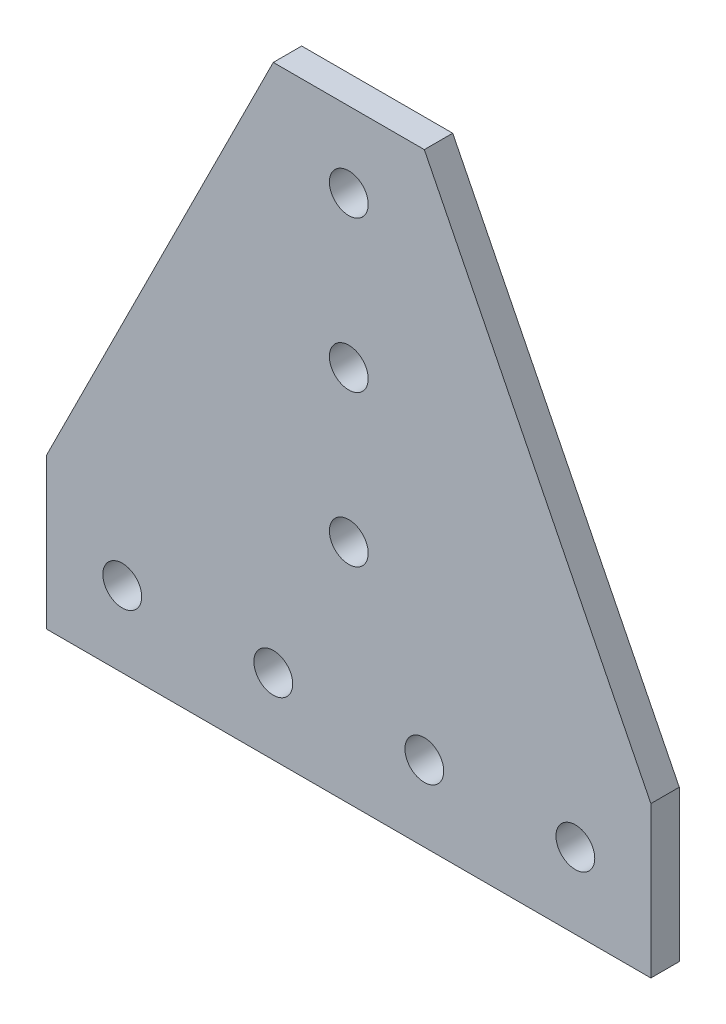
ISO-10303-21;
HEADER;
FILE_DESCRIPTION(('STEP AP214'),'2;1');
FILE_NAME('part.step','',(''),(''),'','','');
FILE_SCHEMA(('AUTOMOTIVE_DESIGN { 1 0 10303 214 1 1 1 1 }'));
ENDSEC;
DATA;
#1=APPLICATION_CONTEXT('core data for automotive mechanical design processes');
#2=APPLICATION_PROTOCOL_DEFINITION('international standard','automotive_design',2000,#1);
#3=PRODUCT_CONTEXT('',#1,'mechanical');
#4=PRODUCT('Part','Part','',(#3));
#5=PRODUCT_RELATED_PRODUCT_CATEGORY('part','',(#4));
#6=PRODUCT_DEFINITION_FORMATION('','',#4);
#7=PRODUCT_DEFINITION_CONTEXT('part definition',#1,'design');
#8=PRODUCT_DEFINITION('design','',#6,#7);
#9=PRODUCT_DEFINITION_SHAPE('','',#8);
#10=(LENGTH_UNIT() NAMED_UNIT(*) SI_UNIT(.MILLI.,.METRE.));
#11=(NAMED_UNIT(*) PLANE_ANGLE_UNIT() SI_UNIT($,.RADIAN.));
#12=(NAMED_UNIT(*) SI_UNIT($,.STERADIAN.) SOLID_ANGLE_UNIT());
#13=UNCERTAINTY_MEASURE_WITH_UNIT(LENGTH_MEASURE(1.E-05),#10,'distance_accuracy_value','');
#14=(GEOMETRIC_REPRESENTATION_CONTEXT(3) GLOBAL_UNCERTAINTY_ASSIGNED_CONTEXT((#13)) GLOBAL_UNIT_ASSIGNED_CONTEXT((#10,
#11,#12)) REPRESENTATION_CONTEXT('',''));
#15=CARTESIAN_POINT('',(0.,0.,0.));
#16=DIRECTION('',(0.,0.,1.));
#17=DIRECTION('',(1.,0.,0.));
#18=AXIS2_PLACEMENT_3D('',#15,#16,#17);
#19=CARTESIAN_POINT('',(50.8,-25.4,-2.3876));
#20=DIRECTION('',(0.894427190999916,0.447213595499958,0.));
#21=DIRECTION('',(-0.447213595499958,0.894427190999916,0.));
#22=AXIS2_PLACEMENT_3D('',#19,#20,#21);
#23=PLANE('',#22);
#24=DIRECTION('',(0.,0.,1.));
#25=VECTOR('',#24,1.);
#26=CARTESIAN_POINT('',(12.7,50.8,-2.3876));
#27=LINE('',#26,#25);
#28=CARTESIAN_POINT('',(12.7,50.8,-2.3876));
#29=VERTEX_POINT('',#28);
#30=CARTESIAN_POINT('',(12.7,50.8,2.3876));
#31=VERTEX_POINT('',#30);
#32=EDGE_CURVE('E35',#29,#31,#27,.T.);
#33=ORIENTED_EDGE('',*,*,#32,.T.);
#34=DIRECTION('',(-0.447213595499958,0.894427190999916,0.));
#35=VECTOR('',#34,1.);
#36=CARTESIAN_POINT('',(50.8,-25.4,2.3876));
#37=LINE('',#36,#35);
#38=CARTESIAN_POINT('',(50.8,-25.4,2.3876));
#39=VERTEX_POINT('',#38);
#40=EDGE_CURVE('E84',#39,#31,#37,.T.);
#41=ORIENTED_EDGE('',*,*,#40,.F.);
#42=DIRECTION('',(0.,0.,1.));
#43=VECTOR('',#42,1.);
#44=CARTESIAN_POINT('',(50.8,-25.4,-2.3876));
#45=LINE('',#44,#43);
#46=CARTESIAN_POINT('',(50.8,-25.4,-2.3876));
#47=VERTEX_POINT('',#46);
#48=EDGE_CURVE('E11',#47,#39,#45,.T.);
#49=ORIENTED_EDGE('',*,*,#48,.F.);
#50=DIRECTION('',(-0.447213595499958,0.894427190999916,0.));
#51=VECTOR('',#50,1.);
#52=CARTESIAN_POINT('',(50.8,-25.4,-2.3876));
#53=LINE('',#52,#51);
#54=EDGE_CURVE('E85',#47,#29,#53,.T.);
#55=ORIENTED_EDGE('',*,*,#54,.T.);
#56=EDGE_LOOP('',(#33,#41,#49,#55));
#57=FACE_BOUND('',#56,.T.);
#58=ADVANCED_FACE('F32',(#57),#23,.T.);
#59=CARTESIAN_POINT('',(50.8,-50.8,-2.3876));
#60=DIRECTION('',(1.,0.,0.));
#61=DIRECTION('',(0.,1.,0.));
#62=AXIS2_PLACEMENT_3D('',#59,#60,#61);
#63=PLANE('',#62);
#64=ORIENTED_EDGE('',*,*,#48,.T.);
#65=DIRECTION('',(0.,1.,0.));
#66=VECTOR('',#65,1.);
#67=CARTESIAN_POINT('',(50.8,-50.8,2.3876));
#68=LINE('',#67,#66);
#69=CARTESIAN_POINT('',(50.8,-50.8,2.3876));
#70=VERTEX_POINT('',#69);
#71=EDGE_CURVE('E103',#70,#39,#68,.T.);
#72=ORIENTED_EDGE('',*,*,#71,.F.);
#73=DIRECTION('',(0.,0.,1.));
#74=VECTOR('',#73,1.);
#75=CARTESIAN_POINT('',(50.8,-50.8,-2.3876));
#76=LINE('',#75,#74);
#77=CARTESIAN_POINT('',(50.8,-50.8,-2.3876));
#78=VERTEX_POINT('',#77);
#79=EDGE_CURVE('E40',#78,#70,#76,.T.);
#80=ORIENTED_EDGE('',*,*,#79,.F.);
#81=DIRECTION('',(0.,1.,0.));
#82=VECTOR('',#81,1.);
#83=CARTESIAN_POINT('',(50.8,-50.8,-2.3876));
#84=LINE('',#83,#82);
#85=EDGE_CURVE('E90',#78,#47,#84,.T.);
#86=ORIENTED_EDGE('',*,*,#85,.T.);
#87=EDGE_LOOP('',(#64,#72,#80,#86));
#88=FACE_BOUND('',#87,.T.);
#89=ADVANCED_FACE('F147',(#88),#63,.T.);
#90=CARTESIAN_POINT('',(50.8,-50.8,-2.3876));
#91=DIRECTION('',(0.,1.,0.));
#92=DIRECTION('',(0.,0.,1.));
#93=AXIS2_PLACEMENT_3D('',#90,#91,#92);
#94=PLANE('',#93);
#95=ORIENTED_EDGE('',*,*,#79,.T.);
#96=DIRECTION('',(-1.,0.,0.));
#97=VECTOR('',#96,1.);
#98=CARTESIAN_POINT('',(50.8,-50.8,2.3876));
#99=LINE('',#98,#97);
#100=CARTESIAN_POINT('',(-50.8,-50.8,2.3876));
#101=VERTEX_POINT('',#100);
#102=EDGE_CURVE('E117',#70,#101,#99,.T.);
#103=ORIENTED_EDGE('',*,*,#102,.T.);
#104=DIRECTION('',(0.,0.,1.));
#105=VECTOR('',#104,1.);
#106=CARTESIAN_POINT('',(-50.8,-50.8,-2.3876));
#107=LINE('',#106,#105);
#108=CARTESIAN_POINT('',(-50.8,-50.8,-2.3876));
#109=VERTEX_POINT('',#108);
#110=EDGE_CURVE('E132',#109,#101,#107,.T.);
#111=ORIENTED_EDGE('',*,*,#110,.F.);
#112=DIRECTION('',(-1.,0.,0.));
#113=VECTOR('',#112,1.);
#114=CARTESIAN_POINT('',(50.8,-50.8,-2.3876));
#115=LINE('',#114,#113);
#116=EDGE_CURVE('E128',#78,#109,#115,.T.);
#117=ORIENTED_EDGE('',*,*,#116,.F.);
#118=EDGE_LOOP('',(#95,#103,#111,#117));
#119=FACE_BOUND('',#118,.T.);
#120=ADVANCED_FACE('F145',(#119),#94,.F.);
#121=CARTESIAN_POINT('',(-50.8,-50.8,-2.3876));
#122=DIRECTION('',(1.,0.,0.));
#123=DIRECTION('',(0.,1.,0.));
#124=AXIS2_PLACEMENT_3D('',#121,#122,#123);
#125=PLANE('',#124);
#126=ORIENTED_EDGE('',*,*,#110,.T.);
#127=DIRECTION('',(0.,1.,0.));
#128=VECTOR('',#127,1.);
#129=CARTESIAN_POINT('',(-50.8,-50.8,2.3876));
#130=LINE('',#129,#128);
#131=CARTESIAN_POINT('',(-50.8,-25.4,2.3876));
#132=VERTEX_POINT('',#131);
#133=EDGE_CURVE('E114',#101,#132,#130,.T.);
#134=ORIENTED_EDGE('',*,*,#133,.T.);
#135=DIRECTION('',(0.,0.,1.));
#136=VECTOR('',#135,1.);
#137=CARTESIAN_POINT('',(-50.8,-25.4,-2.3876));
#138=LINE('',#137,#136);
#139=CARTESIAN_POINT('',(-50.8,-25.4,-2.3876));
#140=VERTEX_POINT('',#139);
#141=EDGE_CURVE('E134',#140,#132,#138,.T.);
#142=ORIENTED_EDGE('',*,*,#141,.F.);
#143=DIRECTION('',(0.,1.,0.));
#144=VECTOR('',#143,1.);
#145=CARTESIAN_POINT('',(-50.8,-50.8,-2.3876));
#146=LINE('',#145,#144);
#147=EDGE_CURVE('E126',#109,#140,#146,.T.);
#148=ORIENTED_EDGE('',*,*,#147,.F.);
#149=EDGE_LOOP('',(#126,#134,#142,#148));
#150=FACE_BOUND('',#149,.T.);
#151=ADVANCED_FACE('F142',(#150),#125,.F.);
#152=CARTESIAN_POINT('',(-50.8,-25.4,-2.3876));
#153=DIRECTION('',(0.894427190999916,-0.447213595499958,0.));
#154=DIRECTION('',(0.447213595499958,0.894427190999916,0.));
#155=AXIS2_PLACEMENT_3D('',#152,#153,#154);
#156=PLANE('',#155);
#157=ORIENTED_EDGE('',*,*,#141,.T.);
#158=DIRECTION('',(0.447213595499958,0.894427190999916,0.));
#159=VECTOR('',#158,1.);
#160=CARTESIAN_POINT('',(-50.8,-25.4,2.3876));
#161=LINE('',#160,#159);
#162=CARTESIAN_POINT('',(-12.7,50.8,2.3876));
#163=VERTEX_POINT('',#162);
#164=EDGE_CURVE('E98',#132,#163,#161,.T.);
#165=ORIENTED_EDGE('',*,*,#164,.T.);
#166=DIRECTION('',(0.,0.,1.));
#167=VECTOR('',#166,1.);
#168=CARTESIAN_POINT('',(-12.7,50.8,-2.3876));
#169=LINE('',#168,#167);
#170=CARTESIAN_POINT('',(-12.7,50.8,-2.3876));
#171=VERTEX_POINT('',#170);
#172=EDGE_CURVE('E89',#171,#163,#169,.T.);
#173=ORIENTED_EDGE('',*,*,#172,.F.);
#174=DIRECTION('',(0.447213595499958,0.894427190999916,0.));
#175=VECTOR('',#174,1.);
#176=CARTESIAN_POINT('',(-50.8,-25.4,-2.3876));
#177=LINE('',#176,#175);
#178=EDGE_CURVE('E124',#140,#171,#177,.T.);
#179=ORIENTED_EDGE('',*,*,#178,.F.);
#180=EDGE_LOOP('',(#157,#165,#173,#179));
#181=FACE_BOUND('',#180,.T.);
#182=ADVANCED_FACE('F138',(#181),#156,.F.);
#183=CARTESIAN_POINT('',(12.7,50.8,-2.3876));
#184=DIRECTION('',(0.,1.,0.));
#185=DIRECTION('',(0.,0.,1.));
#186=AXIS2_PLACEMENT_3D('',#183,#184,#185);
#187=PLANE('',#186);
#188=ORIENTED_EDGE('',*,*,#172,.T.);
#189=DIRECTION('',(-1.,0.,0.));
#190=VECTOR('',#189,1.);
#191=CARTESIAN_POINT('',(12.7,50.8,2.3876));
#192=LINE('',#191,#190);
#193=EDGE_CURVE('E92',#31,#163,#192,.T.);
#194=ORIENTED_EDGE('',*,*,#193,.F.);
#195=ORIENTED_EDGE('',*,*,#32,.F.);
#196=DIRECTION('',(-1.,0.,0.));
#197=VECTOR('',#196,1.);
#198=CARTESIAN_POINT('',(12.7,50.8,-2.3876));
#199=LINE('',#198,#197);
#200=EDGE_CURVE('E122',#29,#171,#199,.T.);
#201=ORIENTED_EDGE('',*,*,#200,.T.);
#202=EDGE_LOOP('',(#188,#194,#195,#201));
#203=FACE_BOUND('',#202,.T.);
#204=ADVANCED_FACE('F93',(#203),#187,.T.);
#205=CARTESIAN_POINT('',(0.,0.,-2.3876));
#206=DIRECTION('',(0.,0.,1.));
#207=DIRECTION('',(1.,0.,0.));
#208=AXIS2_PLACEMENT_3D('',#205,#206,#207);
#209=PLANE('',#208);
#210=CARTESIAN_POINT('',(-38.1,-38.1,-2.3876));
#211=DIRECTION('',(0.,0.,1.));
#212=DIRECTION('',(1.,0.,0.));
#213=AXIS2_PLACEMENT_3D('',#210,#211,#212);
#214=CIRCLE('',#213,3.26389999999999);
#215=CARTESIAN_POINT('',(-34.8361,-38.1,-2.3876));
#216=VERTEX_POINT('',#215);
#217=EDGE_CURVE('E104',#216,#216,#214,.T.);
#218=ORIENTED_EDGE('',*,*,#217,.T.);
#219=EDGE_LOOP('',(#218));
#220=FACE_BOUND('',#219,.T.);
#221=CARTESIAN_POINT('',(9.31178073069464E-13,-12.7,-2.3876));
#222=DIRECTION('',(0.,0.,1.));
#223=DIRECTION('',(1.,0.,0.));
#224=AXIS2_PLACEMENT_3D('',#221,#222,#223);
#225=CIRCLE('',#224,3.2639);
#226=CARTESIAN_POINT('',(3.26390000000093,-12.7,-2.3876));
#227=VERTEX_POINT('',#226);
#228=EDGE_CURVE('E282',#227,#227,#225,.T.);
#229=ORIENTED_EDGE('',*,*,#228,.T.);
#230=EDGE_LOOP('',(#229));
#231=FACE_BOUND('',#230,.T.);
#232=CARTESIAN_POINT('',(38.1,-38.1,-2.3876));
#233=DIRECTION('',(0.,0.,1.));
#234=DIRECTION('',(1.,0.,0.));
#235=AXIS2_PLACEMENT_3D('',#232,#233,#234);
#236=CIRCLE('',#235,3.26389999999999);
#237=CARTESIAN_POINT('',(41.3639,-38.1,-2.3876));
#238=VERTEX_POINT('',#237);
#239=EDGE_CURVE('E275',#238,#238,#236,.T.);
#240=ORIENTED_EDGE('',*,*,#239,.T.);
#241=EDGE_LOOP('',(#240));
#242=FACE_BOUND('',#241,.T.);
#243=CARTESIAN_POINT('',(3.9907631702977E-13,38.1,-2.3876));
#244=DIRECTION('',(0.,0.,1.));
#245=DIRECTION('',(1.,0.,0.));
#246=AXIS2_PLACEMENT_3D('',#243,#244,#245);
#247=CIRCLE('',#246,3.2639);
#248=CARTESIAN_POINT('',(3.2639000000004,38.1,-2.3876));
#249=VERTEX_POINT('',#248);
#250=EDGE_CURVE('E269',#249,#249,#247,.T.);
#251=ORIENTED_EDGE('',*,*,#250,.T.);
#252=EDGE_LOOP('',(#251));
#253=FACE_BOUND('',#252,.T.);
#254=CARTESIAN_POINT('',(-12.7,-38.1,-2.3876));
#255=DIRECTION('',(0.,0.,1.));
#256=DIRECTION('',(1.,0.,0.));
#257=AXIS2_PLACEMENT_3D('',#254,#255,#256);
#258=CIRCLE('',#257,3.26389999999999);
#259=CARTESIAN_POINT('',(-9.43610000000001,-38.1,-2.3876));
#260=VERTEX_POINT('',#259);
#261=EDGE_CURVE('E300',#260,#260,#258,.T.);
#262=ORIENTED_EDGE('',*,*,#261,.T.);
#263=EDGE_LOOP('',(#262));
#264=FACE_BOUND('',#263,.T.);
#265=CARTESIAN_POINT('',(12.7,-38.1,-2.3876));
#266=DIRECTION('',(0.,0.,1.));
#267=DIRECTION('',(1.,0.,0.));
#268=AXIS2_PLACEMENT_3D('',#265,#266,#267);
#269=CIRCLE('',#268,3.26389999999999);
#270=CARTESIAN_POINT('',(15.9639,-38.1,-2.3876));
#271=VERTEX_POINT('',#270);
#272=EDGE_CURVE('E288',#271,#271,#269,.T.);
#273=ORIENTED_EDGE('',*,*,#272,.T.);
#274=EDGE_LOOP('',(#273));
#275=FACE_BOUND('',#274,.T.);
#276=CARTESIAN_POINT('',(6.65127195049617E-13,12.7,-2.3876));
#277=DIRECTION('',(0.,0.,1.));
#278=DIRECTION('',(1.,0.,0.));
#279=AXIS2_PLACEMENT_3D('',#276,#277,#278);
#280=CIRCLE('',#279,3.2639);
#281=CARTESIAN_POINT('',(3.26390000000067,12.7,-2.3876));
#282=VERTEX_POINT('',#281);
#283=EDGE_CURVE('E294',#282,#282,#280,.T.);
#284=ORIENTED_EDGE('',*,*,#283,.T.);
#285=EDGE_LOOP('',(#284));
#286=FACE_BOUND('',#285,.T.);
#287=ORIENTED_EDGE('',*,*,#54,.F.);
#288=ORIENTED_EDGE('',*,*,#85,.F.);
#289=ORIENTED_EDGE('',*,*,#116,.T.);
#290=ORIENTED_EDGE('',*,*,#147,.T.);
#291=ORIENTED_EDGE('',*,*,#178,.T.);
#292=ORIENTED_EDGE('',*,*,#200,.F.);
#293=EDGE_LOOP('',(#287,#288,#289,#290,#291,#292));
#294=FACE_BOUND('',#293,.T.);
#295=ADVANCED_FACE('F149',(#220,#231,#242,#253,#264,#275,#286,#294),#209,.F.);
#296=CARTESIAN_POINT('',(0.,0.,2.3876));
#297=DIRECTION('',(0.,0.,1.));
#298=DIRECTION('',(1.,0.,0.));
#299=AXIS2_PLACEMENT_3D('',#296,#297,#298);
#300=PLANE('',#299);
#301=CARTESIAN_POINT('',(-38.1,-38.1,2.3876));
#302=DIRECTION('',(0.,0.,1.));
#303=DIRECTION('',(1.,0.,0.));
#304=AXIS2_PLACEMENT_3D('',#301,#302,#303);
#305=CIRCLE('',#304,3.26389999999999);
#306=CARTESIAN_POINT('',(-34.8361,-38.1,2.3876));
#307=VERTEX_POINT('',#306);
#308=EDGE_CURVE('E107',#307,#307,#305,.T.);
#309=ORIENTED_EDGE('',*,*,#308,.F.);
#310=EDGE_LOOP('',(#309));
#311=FACE_BOUND('',#310,.T.);
#312=CARTESIAN_POINT('',(9.31178073069464E-13,-12.7,2.3876));
#313=DIRECTION('',(0.,0.,1.));
#314=DIRECTION('',(1.,0.,0.));
#315=AXIS2_PLACEMENT_3D('',#312,#313,#314);
#316=CIRCLE('',#315,3.2639);
#317=CARTESIAN_POINT('',(3.26390000000093,-12.7,2.3876));
#318=VERTEX_POINT('',#317);
#319=EDGE_CURVE('E285',#318,#318,#316,.T.);
#320=ORIENTED_EDGE('',*,*,#319,.F.);
#321=EDGE_LOOP('',(#320));
#322=FACE_BOUND('',#321,.T.);
#323=CARTESIAN_POINT('',(38.1,-38.1,2.3876));
#324=DIRECTION('',(0.,0.,1.));
#325=DIRECTION('',(1.,0.,0.));
#326=AXIS2_PLACEMENT_3D('',#323,#324,#325);
#327=CIRCLE('',#326,3.26389999999999);
#328=CARTESIAN_POINT('',(41.3639,-38.1,2.3876));
#329=VERTEX_POINT('',#328);
#330=EDGE_CURVE('E279',#329,#329,#327,.T.);
#331=ORIENTED_EDGE('',*,*,#330,.F.);
#332=EDGE_LOOP('',(#331));
#333=FACE_BOUND('',#332,.T.);
#334=CARTESIAN_POINT('',(3.9907631702977E-13,38.1,2.3876));
#335=DIRECTION('',(0.,0.,1.));
#336=DIRECTION('',(1.,0.,0.));
#337=AXIS2_PLACEMENT_3D('',#334,#335,#336);
#338=CIRCLE('',#337,3.2639);
#339=CARTESIAN_POINT('',(3.2639000000004,38.1,2.3876));
#340=VERTEX_POINT('',#339);
#341=EDGE_CURVE('E272',#340,#340,#338,.T.);
#342=ORIENTED_EDGE('',*,*,#341,.F.);
#343=EDGE_LOOP('',(#342));
#344=FACE_BOUND('',#343,.T.);
#345=CARTESIAN_POINT('',(-12.7,-38.1,2.3876));
#346=DIRECTION('',(0.,0.,1.));
#347=DIRECTION('',(1.,0.,0.));
#348=AXIS2_PLACEMENT_3D('',#345,#346,#347);
#349=CIRCLE('',#348,3.26389999999999);
#350=CARTESIAN_POINT('',(-9.43610000000001,-38.1,2.3876));
#351=VERTEX_POINT('',#350);
#352=EDGE_CURVE('E110',#351,#351,#349,.T.);
#353=ORIENTED_EDGE('',*,*,#352,.F.);
#354=EDGE_LOOP('',(#353));
#355=FACE_BOUND('',#354,.T.);
#356=CARTESIAN_POINT('',(12.7,-38.1,2.3876));
#357=DIRECTION('',(0.,0.,1.));
#358=DIRECTION('',(1.,0.,0.));
#359=AXIS2_PLACEMENT_3D('',#356,#357,#358);
#360=CIRCLE('',#359,3.26389999999999);
#361=CARTESIAN_POINT('',(15.9639,-38.1,2.3876));
#362=VERTEX_POINT('',#361);
#363=EDGE_CURVE('E291',#362,#362,#360,.T.);
#364=ORIENTED_EDGE('',*,*,#363,.F.);
#365=EDGE_LOOP('',(#364));
#366=FACE_BOUND('',#365,.T.);
#367=CARTESIAN_POINT('',(6.65127195049617E-13,12.7,2.3876));
#368=DIRECTION('',(0.,0.,1.));
#369=DIRECTION('',(1.,0.,0.));
#370=AXIS2_PLACEMENT_3D('',#367,#368,#369);
#371=CIRCLE('',#370,3.2639);
#372=CARTESIAN_POINT('',(3.26390000000067,12.7,2.3876));
#373=VERTEX_POINT('',#372);
#374=EDGE_CURVE('E278',#373,#373,#371,.T.);
#375=ORIENTED_EDGE('',*,*,#374,.F.);
#376=EDGE_LOOP('',(#375));
#377=FACE_BOUND('',#376,.T.);
#378=ORIENTED_EDGE('',*,*,#40,.T.);
#379=ORIENTED_EDGE('',*,*,#193,.T.);
#380=ORIENTED_EDGE('',*,*,#164,.F.);
#381=ORIENTED_EDGE('',*,*,#133,.F.);
#382=ORIENTED_EDGE('',*,*,#102,.F.);
#383=ORIENTED_EDGE('',*,*,#71,.T.);
#384=EDGE_LOOP('',(#378,#379,#380,#381,#382,#383));
#385=FACE_BOUND('',#384,.T.);
#386=ADVANCED_FACE('F101',(#311,#322,#333,#344,#355,#366,#377,#385),#300,.T.);
#387=CARTESIAN_POINT('',(6.65127195049617E-13,12.7,-2.3876));
#388=DIRECTION('',(0.,0.,1.));
#389=DIRECTION('',(1.,0.,0.));
#390=AXIS2_PLACEMENT_3D('',#387,#388,#389);
#391=CYLINDRICAL_SURFACE('',#390,3.2639);
#392=ORIENTED_EDGE('',*,*,#283,.F.);
#393=EDGE_LOOP('',(#392));
#394=FACE_BOUND('',#393,.T.);
#395=ORIENTED_EDGE('',*,*,#374,.T.);
#396=EDGE_LOOP('',(#395));
#397=FACE_BOUND('',#396,.T.);
#398=ADVANCED_FACE('F157',(#394,#397),#391,.F.);
#399=CARTESIAN_POINT('',(12.7,-38.1,-2.3876));
#400=DIRECTION('',(0.,0.,1.));
#401=DIRECTION('',(1.,0.,0.));
#402=AXIS2_PLACEMENT_3D('',#399,#400,#401);
#403=CYLINDRICAL_SURFACE('',#402,3.26389999999999);
#404=ORIENTED_EDGE('',*,*,#272,.F.);
#405=EDGE_LOOP('',(#404));
#406=FACE_BOUND('',#405,.T.);
#407=ORIENTED_EDGE('',*,*,#363,.T.);
#408=EDGE_LOOP('',(#407));
#409=FACE_BOUND('',#408,.T.);
#410=ADVANCED_FACE('F201',(#406,#409),#403,.F.);
#411=CARTESIAN_POINT('',(-12.7,-38.1,-2.3876));
#412=DIRECTION('',(0.,0.,1.));
#413=DIRECTION('',(1.,0.,0.));
#414=AXIS2_PLACEMENT_3D('',#411,#412,#413);
#415=CYLINDRICAL_SURFACE('',#414,3.26389999999999);
#416=ORIENTED_EDGE('',*,*,#261,.F.);
#417=EDGE_LOOP('',(#416));
#418=FACE_BOUND('',#417,.T.);
#419=ORIENTED_EDGE('',*,*,#352,.T.);
#420=EDGE_LOOP('',(#419));
#421=FACE_BOUND('',#420,.T.);
#422=ADVANCED_FACE('F211',(#418,#421),#415,.F.);
#423=CARTESIAN_POINT('',(3.9907631702977E-13,38.1,-2.3876));
#424=DIRECTION('',(0.,0.,1.));
#425=DIRECTION('',(1.,0.,0.));
#426=AXIS2_PLACEMENT_3D('',#423,#424,#425);
#427=CYLINDRICAL_SURFACE('',#426,3.2639);
#428=ORIENTED_EDGE('',*,*,#250,.F.);
#429=EDGE_LOOP('',(#428));
#430=FACE_BOUND('',#429,.T.);
#431=ORIENTED_EDGE('',*,*,#341,.T.);
#432=EDGE_LOOP('',(#431));
#433=FACE_BOUND('',#432,.T.);
#434=ADVANCED_FACE('F221',(#430,#433),#427,.F.);
#435=CARTESIAN_POINT('',(38.1,-38.1,-2.3876));
#436=DIRECTION('',(0.,0.,1.));
#437=DIRECTION('',(1.,0.,0.));
#438=AXIS2_PLACEMENT_3D('',#435,#436,#437);
#439=CYLINDRICAL_SURFACE('',#438,3.26389999999999);
#440=ORIENTED_EDGE('',*,*,#239,.F.);
#441=EDGE_LOOP('',(#440));
#442=FACE_BOUND('',#441,.T.);
#443=ORIENTED_EDGE('',*,*,#330,.T.);
#444=EDGE_LOOP('',(#443));
#445=FACE_BOUND('',#444,.T.);
#446=ADVANCED_FACE('F231',(#442,#445),#439,.F.);
#447=CARTESIAN_POINT('',(9.31178073069464E-13,-12.7,-2.3876));
#448=DIRECTION('',(0.,0.,1.));
#449=DIRECTION('',(1.,0.,0.));
#450=AXIS2_PLACEMENT_3D('',#447,#448,#449);
#451=CYLINDRICAL_SURFACE('',#450,3.2639);
#452=ORIENTED_EDGE('',*,*,#228,.F.);
#453=EDGE_LOOP('',(#452));
#454=FACE_BOUND('',#453,.T.);
#455=ORIENTED_EDGE('',*,*,#319,.T.);
#456=EDGE_LOOP('',(#455));
#457=FACE_BOUND('',#456,.T.);
#458=ADVANCED_FACE('F241',(#454,#457),#451,.F.);
#459=CARTESIAN_POINT('',(-38.1,-38.1,-2.3876));
#460=DIRECTION('',(0.,0.,1.));
#461=DIRECTION('',(1.,0.,0.));
#462=AXIS2_PLACEMENT_3D('',#459,#460,#461);
#463=CYLINDRICAL_SURFACE('',#462,3.26389999999999);
#464=ORIENTED_EDGE('',*,*,#217,.F.);
#465=EDGE_LOOP('',(#464));
#466=FACE_BOUND('',#465,.T.);
#467=ORIENTED_EDGE('',*,*,#308,.T.);
#468=EDGE_LOOP('',(#467));
#469=FACE_BOUND('',#468,.T.);
#470=ADVANCED_FACE('F251',(#466,#469),#463,.F.);
#471=CLOSED_SHELL('',(#58,#89,#120,#151,#182,#204,#295,#386,#398,#410,#422,#434,#446,#458,#470));
#472=MANIFOLD_SOLID_BREP('B2',#471);
#473=ADVANCED_BREP_SHAPE_REPRESENTATION('',(#18,#472),#14);
#474=SHAPE_DEFINITION_REPRESENTATION(#9,#473);
ENDSEC;
END-ISO-10303-21;
